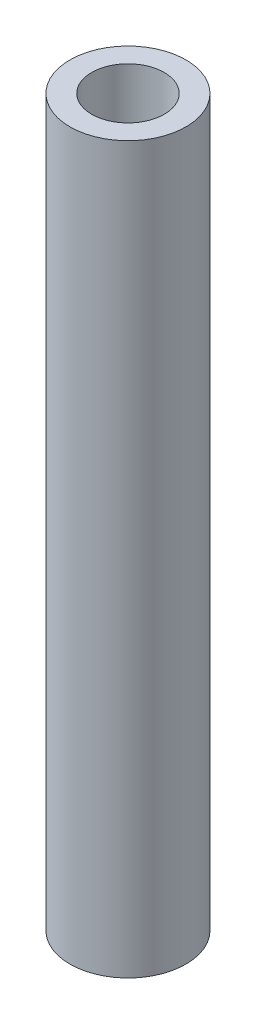
ISO-10303-21;
HEADER;
FILE_DESCRIPTION(('STEP AP214'),'2;1');
FILE_NAME('part.step','',(''),(''),'','','');
FILE_SCHEMA(('AUTOMOTIVE_DESIGN { 1 0 10303 214 1 1 1 1 }'));
ENDSEC;
DATA;
#1=APPLICATION_CONTEXT('core data for automotive mechanical design processes');
#2=APPLICATION_PROTOCOL_DEFINITION('international standard','automotive_design',2000,#1);
#3=PRODUCT_CONTEXT('',#1,'mechanical');
#4=PRODUCT('Part','Part','',(#3));
#5=PRODUCT_RELATED_PRODUCT_CATEGORY('part','',(#4));
#6=PRODUCT_DEFINITION_FORMATION('','',#4);
#7=PRODUCT_DEFINITION_CONTEXT('part definition',#1,'design');
#8=PRODUCT_DEFINITION('design','',#6,#7);
#9=PRODUCT_DEFINITION_SHAPE('','',#8);
#10=(LENGTH_UNIT() NAMED_UNIT(*) SI_UNIT(.MILLI.,.METRE.));
#11=(NAMED_UNIT(*) PLANE_ANGLE_UNIT() SI_UNIT($,.RADIAN.));
#12=(NAMED_UNIT(*) SI_UNIT($,.STERADIAN.) SOLID_ANGLE_UNIT());
#13=UNCERTAINTY_MEASURE_WITH_UNIT(LENGTH_MEASURE(1.E-05),#10,'distance_accuracy_value','');
#14=(GEOMETRIC_REPRESENTATION_CONTEXT(3) GLOBAL_UNCERTAINTY_ASSIGNED_CONTEXT((#13)) GLOBAL_UNIT_ASSIGNED_CONTEXT((#10,
#11,#12)) REPRESENTATION_CONTEXT('',''));
#15=CARTESIAN_POINT('',(0.,0.,0.));
#16=DIRECTION('',(0.,0.,1.));
#17=DIRECTION('',(1.,0.,0.));
#18=AXIS2_PLACEMENT_3D('',#15,#16,#17);
#19=CARTESIAN_POINT('',(0.,20.,0.));
#20=DIRECTION('',(0.,1.,0.));
#21=DIRECTION('',(0.,0.,1.));
#22=AXIS2_PLACEMENT_3D('',#19,#20,#21);
#23=PLANE('',#22);
#24=CARTESIAN_POINT('',(0.,20.,0.));
#25=DIRECTION('',(0.,1.,0.));
#26=DIRECTION('',(0.,0.,1.));
#27=AXIS2_PLACEMENT_3D('',#24,#25,#26);
#28=CIRCLE('',#27,1.6);
#29=CARTESIAN_POINT('',(0.,20.,1.6));
#30=VERTEX_POINT('',#29);
#31=EDGE_CURVE('E10',#30,#30,#28,.T.);
#32=ORIENTED_EDGE('',*,*,#31,.T.);
#33=EDGE_LOOP('',(#32));
#34=FACE_BOUND('',#33,.T.);
#35=CARTESIAN_POINT('',(0.,20.,0.));
#36=DIRECTION('',(0.,1.,0.));
#37=DIRECTION('',(0.,0.,1.));
#38=AXIS2_PLACEMENT_3D('',#35,#36,#37);
#39=CIRCLE('',#38,1.);
#40=CARTESIAN_POINT('',(0.,20.,1.));
#41=VERTEX_POINT('',#40);
#42=EDGE_CURVE('E43',#41,#41,#39,.T.);
#43=ORIENTED_EDGE('',*,*,#42,.F.);
#44=EDGE_LOOP('',(#43));
#45=FACE_BOUND('',#44,.T.);
#46=ADVANCED_FACE('F32',(#34,#45),#23,.T.);
#47=CARTESIAN_POINT('',(0.,0.,0.));
#48=DIRECTION('',(0.,1.,0.));
#49=DIRECTION('',(0.,0.,1.));
#50=AXIS2_PLACEMENT_3D('',#47,#48,#49);
#51=PLANE('',#50);
#52=CARTESIAN_POINT('',(0.,0.,0.));
#53=DIRECTION('',(0.,1.,0.));
#54=DIRECTION('',(0.,0.,1.));
#55=AXIS2_PLACEMENT_3D('',#52,#53,#54);
#56=CIRCLE('',#55,1.6);
#57=CARTESIAN_POINT('',(0.,0.,1.6));
#58=VERTEX_POINT('',#57);
#59=EDGE_CURVE('E36',#58,#58,#56,.T.);
#60=ORIENTED_EDGE('',*,*,#59,.F.);
#61=EDGE_LOOP('',(#60));
#62=FACE_BOUND('',#61,.T.);
#63=CARTESIAN_POINT('',(0.,0.,0.));
#64=DIRECTION('',(0.,1.,0.));
#65=DIRECTION('',(0.,0.,1.));
#66=AXIS2_PLACEMENT_3D('',#63,#64,#65);
#67=CIRCLE('',#66,1.);
#68=CARTESIAN_POINT('',(0.,0.,1.));
#69=VERTEX_POINT('',#68);
#70=EDGE_CURVE('E45',#69,#69,#67,.T.);
#71=ORIENTED_EDGE('',*,*,#70,.T.);
#72=EDGE_LOOP('',(#71));
#73=FACE_BOUND('',#72,.T.);
#74=ADVANCED_FACE('F55',(#62,#73),#51,.F.);
#75=CARTESIAN_POINT('',(0.,20.,0.));
#76=DIRECTION('',(0.,-1.,0.));
#77=DIRECTION('',(0.,0.,-1.));
#78=AXIS2_PLACEMENT_3D('',#75,#76,#77);
#79=CYLINDRICAL_SURFACE('',#78,1.6);
#80=ORIENTED_EDGE('',*,*,#31,.F.);
#81=EDGE_LOOP('',(#80));
#82=FACE_BOUND('',#81,.T.);
#83=ORIENTED_EDGE('',*,*,#59,.T.);
#84=EDGE_LOOP('',(#83));
#85=FACE_BOUND('',#84,.T.);
#86=ADVANCED_FACE('F34',(#82,#85),#79,.T.);
#87=CARTESIAN_POINT('',(0.,20.,0.));
#88=DIRECTION('',(0.,-1.,0.));
#89=DIRECTION('',(0.,0.,-1.));
#90=AXIS2_PLACEMENT_3D('',#87,#88,#89);
#91=CYLINDRICAL_SURFACE('',#90,1.);
#92=ORIENTED_EDGE('',*,*,#42,.T.);
#93=EDGE_LOOP('',(#92));
#94=FACE_BOUND('',#93,.T.);
#95=ORIENTED_EDGE('',*,*,#70,.F.);
#96=EDGE_LOOP('',(#95));
#97=FACE_BOUND('',#96,.T.);
#98=ADVANCED_FACE('F51',(#94,#97),#91,.F.);
#99=CLOSED_SHELL('',(#46,#74,#86,#98));
#100=MANIFOLD_SOLID_BREP('B2',#99);
#101=ADVANCED_BREP_SHAPE_REPRESENTATION('',(#18,#100),#14);
#102=SHAPE_DEFINITION_REPRESENTATION(#9,#101);
ENDSEC;
END-ISO-10303-21;
